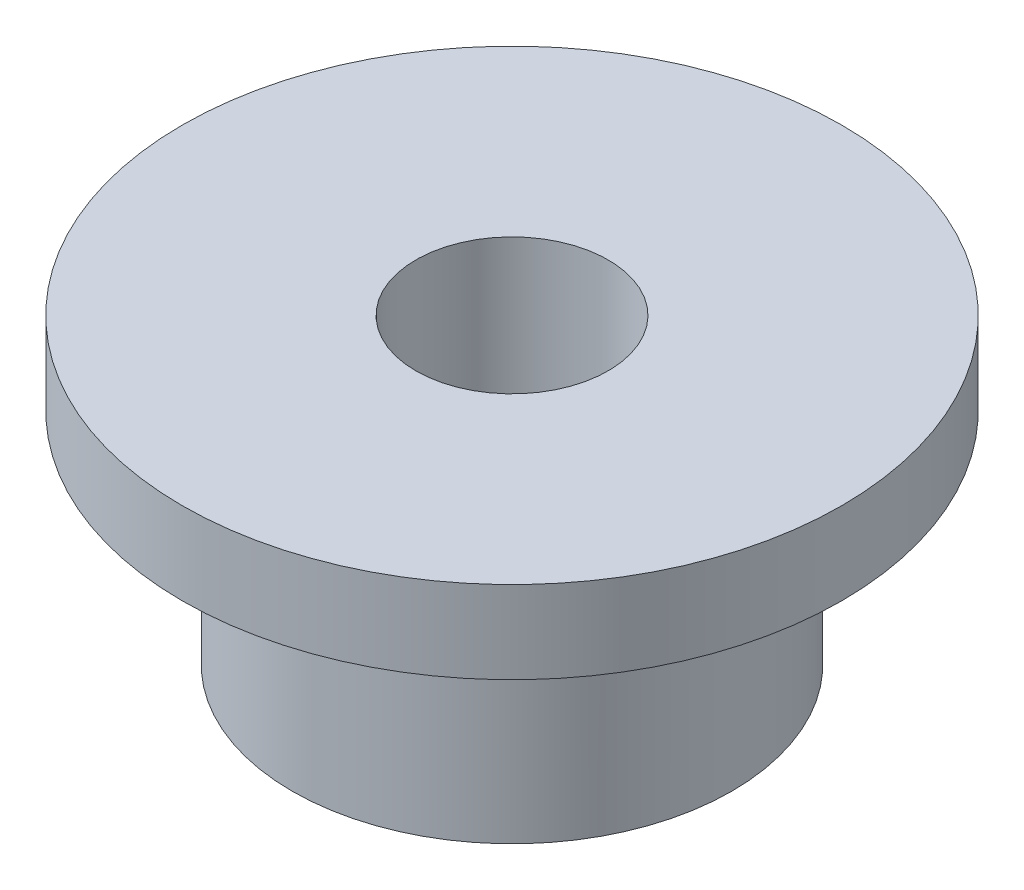
ISO-10303-21;
HEADER;
FILE_DESCRIPTION(('STEP AP214'),'2;1');
FILE_NAME('part.step','',(''),(''),'','','');
FILE_SCHEMA(('AUTOMOTIVE_DESIGN { 1 0 10303 214 1 1 1 1 }'));
ENDSEC;
DATA;
#1=APPLICATION_CONTEXT('core data for automotive mechanical design processes');
#2=APPLICATION_PROTOCOL_DEFINITION('international standard','automotive_design',2000,#1);
#3=PRODUCT_CONTEXT('',#1,'mechanical');
#4=PRODUCT('Part','Part','',(#3));
#5=PRODUCT_RELATED_PRODUCT_CATEGORY('part','',(#4));
#6=PRODUCT_DEFINITION_FORMATION('','',#4);
#7=PRODUCT_DEFINITION_CONTEXT('part definition',#1,'design');
#8=PRODUCT_DEFINITION('design','',#6,#7);
#9=PRODUCT_DEFINITION_SHAPE('','',#8);
#10=(LENGTH_UNIT() NAMED_UNIT(*) SI_UNIT(.MILLI.,.METRE.));
#11=(NAMED_UNIT(*) PLANE_ANGLE_UNIT() SI_UNIT($,.RADIAN.));
#12=(NAMED_UNIT(*) SI_UNIT($,.STERADIAN.) SOLID_ANGLE_UNIT());
#13=UNCERTAINTY_MEASURE_WITH_UNIT(LENGTH_MEASURE(1.E-05),#10,'distance_accuracy_value','');
#14=(GEOMETRIC_REPRESENTATION_CONTEXT(3) GLOBAL_UNCERTAINTY_ASSIGNED_CONTEXT((#13)) GLOBAL_UNIT_ASSIGNED_CONTEXT((#10,
#11,#12)) REPRESENTATION_CONTEXT('',''));
#15=CARTESIAN_POINT('',(0.,0.,0.));
#16=DIRECTION('',(0.,0.,1.));
#17=DIRECTION('',(1.,0.,0.));
#18=AXIS2_PLACEMENT_3D('',#15,#16,#17);
#19=CARTESIAN_POINT('',(0.,0.,0.));
#20=DIRECTION('',(0.,1.,0.));
#21=DIRECTION('',(0.,0.,1.));
#22=AXIS2_PLACEMENT_3D('',#19,#20,#21);
#23=PLANE('',#22);
#24=CARTESIAN_POINT('',(0.,0.,0.));
#25=DIRECTION('',(0.,1.,0.));
#26=DIRECTION('',(0.,0.,1.));
#27=AXIS2_PLACEMENT_3D('',#24,#25,#26);
#28=CIRCLE('',#27,12.);
#29=CARTESIAN_POINT('',(0.,0.,12.));
#30=VERTEX_POINT('',#29);
#31=EDGE_CURVE('E40',#30,#30,#28,.T.);
#32=ORIENTED_EDGE('',*,*,#31,.F.);
#33=EDGE_LOOP('',(#32));
#34=FACE_BOUND('',#33,.T.);
#35=CARTESIAN_POINT('',(0.,0.,0.));
#36=DIRECTION('',(0.,1.,0.));
#37=DIRECTION('',(0.,0.,1.));
#38=AXIS2_PLACEMENT_3D('',#35,#36,#37);
#39=CIRCLE('',#38,8.);
#40=CARTESIAN_POINT('',(0.,0.,8.));
#41=VERTEX_POINT('',#40);
#42=EDGE_CURVE('E10',#41,#41,#39,.F.);
#43=ORIENTED_EDGE('',*,*,#42,.F.);
#44=EDGE_LOOP('',(#43));
#45=FACE_BOUND('',#44,.T.);
#46=ADVANCED_FACE('F29',(#34,#45),#23,.F.);
#47=CARTESIAN_POINT('',(0.,3.,0.));
#48=DIRECTION('',(0.,-1.,0.));
#49=DIRECTION('',(0.,0.,-1.));
#50=AXIS2_PLACEMENT_3D('',#47,#48,#49);
#51=CYLINDRICAL_SURFACE('',#50,12.);
#52=CARTESIAN_POINT('',(0.,3.,0.));
#53=DIRECTION('',(0.,1.,0.));
#54=DIRECTION('',(0.,0.,1.));
#55=AXIS2_PLACEMENT_3D('',#52,#53,#54);
#56=CIRCLE('',#55,12.);
#57=CARTESIAN_POINT('',(0.,3.,12.));
#58=VERTEX_POINT('',#57);
#59=EDGE_CURVE('E36',#58,#58,#56,.T.);
#60=ORIENTED_EDGE('',*,*,#59,.F.);
#61=EDGE_LOOP('',(#60));
#62=FACE_BOUND('',#61,.T.);
#63=ORIENTED_EDGE('',*,*,#31,.T.);
#64=EDGE_LOOP('',(#63));
#65=FACE_BOUND('',#64,.T.);
#66=ADVANCED_FACE('F31',(#62,#65),#51,.T.);
#67=CARTESIAN_POINT('',(0.,3.,0.));
#68=DIRECTION('',(0.,1.,0.));
#69=DIRECTION('',(0.,0.,1.));
#70=AXIS2_PLACEMENT_3D('',#67,#68,#69);
#71=PLANE('',#70);
#72=CARTESIAN_POINT('',(0.,3.,0.));
#73=DIRECTION('',(0.,1.,0.));
#74=DIRECTION('',(0.,0.,1.));
#75=AXIS2_PLACEMENT_3D('',#72,#73,#74);
#76=CIRCLE('',#75,3.5);
#77=CARTESIAN_POINT('',(0.,3.,3.5));
#78=VERTEX_POINT('',#77);
#79=EDGE_CURVE('E50',#78,#78,#76,.T.);
#80=ORIENTED_EDGE('',*,*,#79,.F.);
#81=EDGE_LOOP('',(#80));
#82=FACE_BOUND('',#81,.T.);
#83=ORIENTED_EDGE('',*,*,#59,.T.);
#84=EDGE_LOOP('',(#83));
#85=FACE_BOUND('',#84,.T.);
#86=ADVANCED_FACE('F65',(#82,#85),#71,.T.);
#87=CARTESIAN_POINT('',(0.,-8.,0.));
#88=DIRECTION('',(0.,1.,0.));
#89=DIRECTION('',(0.,0.,1.));
#90=AXIS2_PLACEMENT_3D('',#87,#88,#89);
#91=CYLINDRICAL_SURFACE('',#90,8.);
#92=CARTESIAN_POINT('',(0.,-8.,0.));
#93=DIRECTION('',(0.,-1.,0.));
#94=DIRECTION('',(0.,0.,-1.));
#95=AXIS2_PLACEMENT_3D('',#92,#93,#94);
#96=CIRCLE('',#95,8.);
#97=CARTESIAN_POINT('',(0.,-8.,-8.));
#98=VERTEX_POINT('',#97);
#99=EDGE_CURVE('E45',#98,#98,#96,.T.);
#100=ORIENTED_EDGE('',*,*,#99,.F.);
#101=EDGE_LOOP('',(#100));
#102=FACE_BOUND('',#101,.T.);
#103=ORIENTED_EDGE('',*,*,#42,.T.);
#104=EDGE_LOOP('',(#103));
#105=FACE_BOUND('',#104,.T.);
#106=ADVANCED_FACE('F67',(#102,#105),#91,.T.);
#107=CARTESIAN_POINT('',(0.,-8.,0.));
#108=DIRECTION('',(0.,-1.,0.));
#109=DIRECTION('',(0.,0.,-1.));
#110=AXIS2_PLACEMENT_3D('',#107,#108,#109);
#111=PLANE('',#110);
#112=ORIENTED_EDGE('',*,*,#99,.T.);
#113=EDGE_LOOP('',(#112));
#114=FACE_BOUND('',#113,.T.);
#115=ADVANCED_FACE('F61',(#114),#111,.T.);
#116=CARTESIAN_POINT('',(0.,-5.,0.));
#117=DIRECTION('',(0.,1.,0.));
#118=DIRECTION('',(0.,0.,1.));
#119=AXIS2_PLACEMENT_3D('',#116,#117,#118);
#120=CYLINDRICAL_SURFACE('',#119,3.5);
#121=CARTESIAN_POINT('',(0.,-5.,0.));
#122=DIRECTION('',(0.,1.,0.));
#123=DIRECTION('',(0.,0.,1.));
#124=AXIS2_PLACEMENT_3D('',#121,#122,#123);
#125=CIRCLE('',#124,3.5);
#126=CARTESIAN_POINT('',(0.,-5.,3.5));
#127=VERTEX_POINT('',#126);
#128=EDGE_CURVE('E49',#127,#127,#125,.T.);
#129=ORIENTED_EDGE('',*,*,#128,.F.);
#130=EDGE_LOOP('',(#129));
#131=FACE_BOUND('',#130,.T.);
#132=ORIENTED_EDGE('',*,*,#79,.T.);
#133=EDGE_LOOP('',(#132));
#134=FACE_BOUND('',#133,.T.);
#135=ADVANCED_FACE('F58',(#131,#134),#120,.F.);
#136=CARTESIAN_POINT('',(0.,-5.,0.));
#137=DIRECTION('',(0.,1.,0.));
#138=DIRECTION('',(0.,0.,1.));
#139=AXIS2_PLACEMENT_3D('',#136,#137,#138);
#140=PLANE('',#139);
#141=ORIENTED_EDGE('',*,*,#128,.T.);
#142=EDGE_LOOP('',(#141));
#143=FACE_BOUND('',#142,.T.);
#144=ADVANCED_FACE('F56',(#143),#140,.T.);
#145=CLOSED_SHELL('',(#46,#66,#86,#106,#115,#135,#144));
#146=MANIFOLD_SOLID_BREP('B2',#145);
#147=ADVANCED_BREP_SHAPE_REPRESENTATION('',(#18,#146),#14);
#148=SHAPE_DEFINITION_REPRESENTATION(#9,#147);
ENDSEC;
END-ISO-10303-21;
